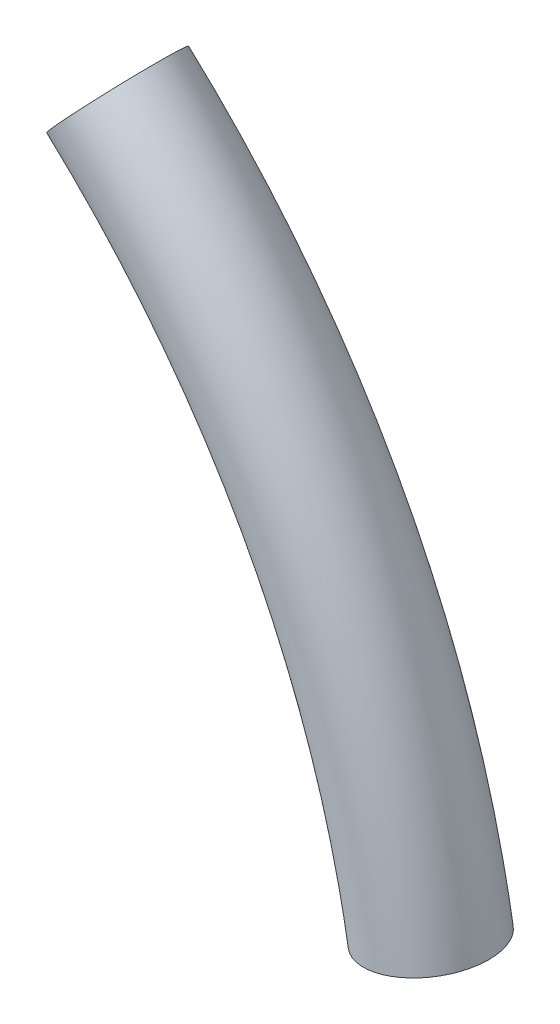
ISO-10303-21;
HEADER;
FILE_DESCRIPTION(('STEP AP214'),'2;1');
FILE_NAME('part.step','',(''),(''),'','','');
FILE_SCHEMA(('AUTOMOTIVE_DESIGN { 1 0 10303 214 1 1 1 1 }'));
ENDSEC;
DATA;
#1=APPLICATION_CONTEXT('core data for automotive mechanical design processes');
#2=APPLICATION_PROTOCOL_DEFINITION('international standard','automotive_design',2000,#1);
#3=PRODUCT_CONTEXT('',#1,'mechanical');
#4=PRODUCT('Part','Part','',(#3));
#5=PRODUCT_RELATED_PRODUCT_CATEGORY('part','',(#4));
#6=PRODUCT_DEFINITION_FORMATION('','',#4);
#7=PRODUCT_DEFINITION_CONTEXT('part definition',#1,'design');
#8=PRODUCT_DEFINITION('design','',#6,#7);
#9=PRODUCT_DEFINITION_SHAPE('','',#8);
#10=(LENGTH_UNIT() NAMED_UNIT(*) SI_UNIT(.MILLI.,.METRE.));
#11=(NAMED_UNIT(*) PLANE_ANGLE_UNIT() SI_UNIT($,.RADIAN.));
#12=(NAMED_UNIT(*) SI_UNIT($,.STERADIAN.) SOLID_ANGLE_UNIT());
#13=UNCERTAINTY_MEASURE_WITH_UNIT(LENGTH_MEASURE(1.E-05),#10,'distance_accuracy_value','');
#14=(GEOMETRIC_REPRESENTATION_CONTEXT(3) GLOBAL_UNCERTAINTY_ASSIGNED_CONTEXT((#13)) GLOBAL_UNIT_ASSIGNED_CONTEXT((#10,
#11,#12)) REPRESENTATION_CONTEXT('',''));
#15=CARTESIAN_POINT('',(0.,0.,0.));
#16=DIRECTION('',(0.,0.,1.));
#17=DIRECTION('',(1.,0.,0.));
#18=AXIS2_PLACEMENT_3D('',#15,#16,#17);
#19=CARTESIAN_POINT('',(0.,0.,-101.5));
#20=DIRECTION('',(0.736829694554362,-0.676078398725271,0.));
#21=DIRECTION('',(0.676078398725271,0.736829694554362,0.));
#22=AXIS2_PLACEMENT_3D('',#19,#20,#21);
#23=PLANE('',#22);
#24=CARTESIAN_POINT('',(4.90980019996349,5.35098679159566,-106.7698));
#25=CARTESIAN_POINT('',(4.90979895214026,5.35098543164508,-106.74734475844));
#26=CARTESIAN_POINT('',(4.90851710616617,5.34958840109457,-106.724869142741));
#27=CARTESIAN_POINT('',(4.90341750681849,5.34403056011521,-106.680517548703));
#28=CARTESIAN_POINT('',(4.89959432603145,5.33986383457442,-106.658642958289));
#29=CARTESIAN_POINT('',(4.88952595748396,5.32889073894603,-106.616190381653));
#30=CARTESIAN_POINT('',(4.88328509258038,5.3220890801601,-106.595610156997));
#31=CARTESIAN_POINT('',(4.86854693682918,5.30602657791048,-106.556262662778));
#32=CARTESIAN_POINT('',(4.86004644498892,5.29676224581817,-106.53749801701));
#33=CARTESIAN_POINT('',(4.8410484341374,5.27605710487703,-106.502372515062));
#34=CARTESIAN_POINT('',(4.83055374795954,5.26461938341536,-106.486008306697));
#35=CARTESIAN_POINT('',(4.80784101835606,5.23986572518907,-106.456095115093));
#36=CARTESIAN_POINT('',(4.79562058296673,5.2265471815228,-106.442550104961));
#37=CARTESIAN_POINT('',(4.76982439127389,5.19843298636209,-106.418698058126));
#38=CARTESIAN_POINT('',(4.75624962861415,5.18363841779862,-106.4083886702));
#39=CARTESIAN_POINT('',(4.72812179725941,5.15298306566095,-106.391286516976));
#40=CARTESIAN_POINT('',(4.71356867106682,5.13712221942254,-106.384493958563));
#41=CARTESIAN_POINT('',(4.68389842957931,5.10478585870784,-106.374619387071));
#42=CARTESIAN_POINT('',(4.66878133088308,5.08831036232178,-106.371537264876));
#43=CARTESIAN_POINT('',(4.63841186556831,5.05521194667375,-106.369170683823));
#44=CARTESIAN_POINT('',(4.62315949894977,5.03858902741179,-106.369886224964));
#45=CARTESIAN_POINT('',(4.59295201698528,5.00566715067217,-106.375094745066));
#46=CARTESIAN_POINT('',(4.57799691039452,4.98936820273643,-106.379587835118));
#47=CARTESIAN_POINT('',(4.54880985059358,4.95755844162202,-106.392223649074));
#48=CARTESIAN_POINT('',(4.53457785490133,4.9420475821439,-106.400366158301));
#49=CARTESIAN_POINT('',(4.50723001278276,4.91224230779563,-106.420076885485));
#50=CARTESIAN_POINT('',(4.49411498746799,4.89794878782076,-106.431647596081));
#51=CARTESIAN_POINT('',(4.46940295234093,4.87101616975632,-106.457865149698));
#52=CARTESIAN_POINT('',(4.45780384605721,4.85837478680982,-106.472507669844));
#53=CARTESIAN_POINT('',(4.43641568142892,4.8350647167945,-106.504486025252));
#54=CARTESIAN_POINT('',(4.42662920209553,4.82439884048254,-106.521825634422));
#55=CARTESIAN_POINT('',(4.40917737894976,4.80537882513794,-106.558664681642));
#56=CARTESIAN_POINT('',(4.40150903826028,4.79702141993371,-106.578161012918));
#57=CARTESIAN_POINT('',(4.38848056492773,4.78282222936021,-106.618813737375));
#58=CARTESIAN_POINT('',(4.3831245721917,4.77698495590321,-106.63997302846));
#59=CARTESIAN_POINT('',(4.37490245471149,4.76802401243429,-106.683286509964));
#60=CARTESIAN_POINT('',(4.37203103119807,4.76489456751441,-106.705438476605));
#61=CARTESIAN_POINT('',(4.36943646358236,4.76206685630904,-106.741730237853));
#62=CARTESIAN_POINT('',(4.36893670085276,4.76152218572041,-106.755761137143));
#63=CARTESIAN_POINT('',(4.36893872880651,4.76152439590275,-106.79225524156));
#64=CARTESIAN_POINT('',(4.3702205747806,4.76292142645326,-106.814730857259));
#65=CARTESIAN_POINT('',(4.37532017412828,4.76847926743263,-106.859082451298));
#66=CARTESIAN_POINT('',(4.37914335491532,4.77264599297341,-106.880957041711));
#67=CARTESIAN_POINT('',(4.38921172346282,4.78361908860181,-106.923409618347));
#68=CARTESIAN_POINT('',(4.39545258836641,4.79042074738775,-106.943989843003));
#69=CARTESIAN_POINT('',(4.4101907441176,4.80648324963737,-106.983337337222));
#70=CARTESIAN_POINT('',(4.41869123595786,4.81574758172968,-107.00210198299));
#71=CARTESIAN_POINT('',(4.43768924680939,4.83645272267082,-107.037227484938));
#72=CARTESIAN_POINT('',(4.44818393298725,4.8478904441325,-107.053591693303));
#73=CARTESIAN_POINT('',(4.47089666259073,4.87264410235879,-107.083504884907));
#74=CARTESIAN_POINT('',(4.48311709798006,4.88596264602506,-107.097049895039));
#75=CARTESIAN_POINT('',(4.5089132896729,4.91407684118576,-107.120901941874));
#76=CARTESIAN_POINT('',(4.52248805233264,4.92887140974924,-107.1312113298));
#77=CARTESIAN_POINT('',(4.55061588368738,4.9595267618869,-107.148313483024));
#78=CARTESIAN_POINT('',(4.56516900987997,4.97538760812532,-107.155106041438));
#79=CARTESIAN_POINT('',(4.59483925136748,5.00772396884002,-107.164980612929));
#80=CARTESIAN_POINT('',(4.60995635006371,5.02419946522608,-107.168062735124));
#81=CARTESIAN_POINT('',(4.64032581537848,5.0572978808741,-107.170429316177));
#82=CARTESIAN_POINT('',(4.65557818199702,5.07392080013607,-107.169713775036));
#83=CARTESIAN_POINT('',(4.68578566396151,5.10684267687569,-107.164505254934));
#84=CARTESIAN_POINT('',(4.70074077055228,5.12314162481143,-107.160012164882));
#85=CARTESIAN_POINT('',(4.72992783035322,5.15495138592584,-107.147376350926));
#86=CARTESIAN_POINT('',(4.74415982604546,5.17046224540396,-107.139233841699));
#87=CARTESIAN_POINT('',(4.77150766816403,5.20026751975223,-107.119523114515));
#88=CARTESIAN_POINT('',(4.7846226934788,5.21456103972709,-107.107952403919));
#89=CARTESIAN_POINT('',(4.80933472860586,5.24149365779153,-107.081734850302));
#90=CARTESIAN_POINT('',(4.82093383488958,5.25413504073803,-107.067092330157));
#91=CARTESIAN_POINT('',(4.84232199951786,5.27744511075336,-107.035113974748));
#92=CARTESIAN_POINT('',(4.85210847885125,5.2881109870653,-107.017774365578));
#93=CARTESIAN_POINT('',(4.86956030199701,5.30713100240991,-106.980935318358));
#94=CARTESIAN_POINT('',(4.8772286426865,5.31548840761413,-106.961438987082));
#95=CARTESIAN_POINT('',(4.89025711601904,5.32968759818763,-106.920786262625));
#96=CARTESIAN_POINT('',(4.89561310875508,5.33552487164463,-106.89962697154));
#97=CARTESIAN_POINT('',(4.90383522623529,5.34448581511354,-106.856313490036));
#98=CARTESIAN_POINT('',(4.90670664974871,5.34761526003342,-106.834161523395));
#99=CARTESIAN_POINT('',(4.90930121736441,5.35044297123879,-106.797869762147));
#100=CARTESIAN_POINT('',(4.90980098009401,5.35098764182742,-106.783838862857));
#101=CARTESIAN_POINT('',(4.90980019996349,5.35098679159566,-106.7698));
#102=B_SPLINE_CURVE_WITH_KNOTS('',3,(#24,#25,#26,#27,#28,#29,#30,#31,#32,#33,#34,#35,#36,#37,
#38,#39,#40,#41,#42,#43,#44,#45,#46,#47,#48,#49,#50,#51,#52,#53,#54,#55,#56,#57,#58,#59,#60,#61,
#62,#63,#64,#65,#66,#67,#68,#69,#70,#71,#72,#73,#74,#75,#76,#77,#78,#79,#80,#81,#82,#83,#84,#85,
#86,#87,#88,#89,#90,#91,#92,#93,#94,#95,#96,#97,#98,#99,#100,#101),.UNSPECIFIED.,.T.,.F.,(4,2,2,
2,2,2,2,2,2,2,2,2,2,2,2,2,2,2,2,2,2,2,2,2,2,2,2,2,2,2,2,2,2,2,2,2,2,2,4),(0.,0.0673217190940811,
0.13478767805546,0.202133559490903,0.269575356418624,0.336922056232697,0.404363034793476,
0.47175489208367,0.539150713403571,0.606544552708827,0.673938392014083,0.74133421333398,
0.808726070624175,0.876167049184949,0.943513748999017,1.01095554592846,1.07830142736562,
1.14576738632871,1.2130891054245,1.25517818200739,1.32249990110147,1.38996586006286,
1.4573117414983,1.52475353842604,1.59210023824011,1.65954121680087,1.72693307409107,
1.79432889541097,1.86172273471622,1.92911657402148,1.99651239534138,2.06390425263158,
2.13134523119235,2.19869193100642,2.26613372793585,2.33347960937301,2.40094556833612,
2.4682672874319,2.51035636401472),.UNSPECIFIED.);
#103=CARTESIAN_POINT('',(4.90980019996349,5.35098679159566,-106.7698));
#104=VERTEX_POINT('',#103);
#105=EDGE_CURVE('E18',#104,#104,#102,.T.);
#106=ORIENTED_EDGE('',*,*,#105,.F.);
#107=EDGE_LOOP('',(#106));
#108=FACE_BOUND('',#107,.T.);
#109=ADVANCED_FACE('F14',(#108),#23,.F.);
#110=CARTESIAN_POINT('',(0.,0.,-101.5));
#111=DIRECTION('',(0.164394298490583,-0.986394705289819,0.));
#112=DIRECTION('',(0.986394705289819,0.164394298490583,0.));
#113=AXIS2_PLACEMENT_3D('',#110,#111,#112);
#114=PLANE('',#113);
#115=CARTESIAN_POINT('',(6.3742560139617,1.06234486072868,-106.7698));
#116=CARTESIAN_POINT('',(6.374257834529,1.06234516414767,-106.74734475844));
#117=CARTESIAN_POINT('',(6.37612804083086,1.06265685606104,-106.724869142741));
#118=CARTESIAN_POINT('',(6.3835683285329,1.06389686766165,-106.680517548703));
#119=CARTESIAN_POINT('',(6.38914632849978,1.06482650707133,-106.658642958289));
#120=CARTESIAN_POINT('',(6.40383602342995,1.0672747177928,-106.616190381653));
#121=CARTESIAN_POINT('',(6.41294141136859,1.06879223796462,-106.595610156997));
#122=CARTESIAN_POINT('',(6.43444430042128,1.07237594775379,-106.556262662778));
#123=CARTESIAN_POINT('',(6.44684647176621,1.07444291572014,-106.53749801701));
#124=CARTESIAN_POINT('',(6.474564466233,1.0790624460476,-106.502372515062));
#125=CARTESIAN_POINT('',(6.48987615626634,1.08161431958082,-106.486008306697));
#126=CARTESIAN_POINT('',(6.52301390518094,1.0871371158379,-106.456095115093));
#127=CARTESIAN_POINT('',(6.54084345392426,1.09010862018838,-106.442550104961));
#128=CARTESIAN_POINT('',(6.57847995725054,1.09638118686862,-106.418698058126));
#129=CARTESIAN_POINT('',(6.59828546211267,1.09968200758531,-106.4083886702));
#130=CARTESIAN_POINT('',(6.63932381501955,1.10652153257582,-106.391286516976));
#131=CARTESIAN_POINT('',(6.66055674695296,1.11006025083067,-106.384493958563));
#132=CARTESIAN_POINT('',(6.7038454678515,1.11727482615889,-106.374619387071));
#133=CARTESIAN_POINT('',(6.72590123259923,1.12095067919615,-106.371537264876));
#134=CARTESIAN_POINT('',(6.77021011725736,1.12833527683359,-106.369170683823));
#135=CARTESIAN_POINT('',(6.79246323716776,1.13204402143378,-106.369886224964));
#136=CARTESIAN_POINT('',(6.83653578899917,1.13938923142138,-106.375094745066));
#137=CARTESIAN_POINT('',(6.8583552081464,1.1430256946799,-106.379587835118));
#138=CARTESIAN_POINT('',(6.90093896959316,1.15012278021025,-106.392223649074));
#139=CARTESIAN_POINT('',(6.9217033738738,1.15358341281198,-106.400366158301));
#140=CARTESIAN_POINT('',(6.96160372672892,1.16023327668692,-106.420076885485));
#141=CARTESIAN_POINT('',(6.9807384773061,1.16342230829978,-106.431647596081));
#142=CARTESIAN_POINT('',(7.01679320210166,1.16943125295272,-106.457865149698));
#143=CARTESIAN_POINT('',(7.03371623506046,1.17225167576792,-106.472507669844));
#144=CARTESIAN_POINT('',(7.06492145088304,1.17745239261777,-106.504486025252));
#145=CARTESIAN_POINT('',(7.07919987098356,1.17983205954358,-106.521825634422));
#146=CARTESIAN_POINT('',(7.10466198600025,1.18407562098385,-106.558664681642));
#147=CARTESIAN_POINT('',(7.11585005334381,1.18594024421485,-106.578161012918));
#148=CARTESIAN_POINT('',(7.13485852504984,1.18910822996612,-106.618813737375));
#149=CARTESIAN_POINT('',(7.14267288931049,1.19041058583228,-106.63997302846));
#150=CARTESIAN_POINT('',(7.1546689139787,1.19240986467008,-106.683286509964));
#151=CARTESIAN_POINT('',(7.15885830526176,1.19310807608321,-106.705438476605));
#152=CARTESIAN_POINT('',(7.16264376529639,1.19373896759501,-106.741730237853));
#153=CARTESIAN_POINT('',(7.16337291639974,1.19386048921662,-106.755761137143));
#154=CARTESIAN_POINT('',(7.16336995762625,1.19385999610216,-106.79225524156));
#155=CARTESIAN_POINT('',(7.16149975132439,1.19354830418879,-106.814730857259));
#156=CARTESIAN_POINT('',(7.15405946362236,1.19230829258817,-106.859082451298));
#157=CARTESIAN_POINT('',(7.14848146365547,1.1913786531785,-106.880957041711));
#158=CARTESIAN_POINT('',(7.1337917687253,1.18893044245703,-106.923409618347));
#159=CARTESIAN_POINT('',(7.12468638078665,1.18741292228521,-106.943989843003));
#160=CARTESIAN_POINT('',(7.10318349173395,1.18382921249603,-106.983337337222));
#161=CARTESIAN_POINT('',(7.09078132038903,1.18176224452968,-107.00210198299));
#162=CARTESIAN_POINT('',(7.06306332592224,1.17714271420222,-107.037227484938));
#163=CARTESIAN_POINT('',(7.04775163588889,1.174590840669,-107.053591693303));
#164=CARTESIAN_POINT('',(7.01461388697428,1.16906804441192,-107.083504884907));
#165=CARTESIAN_POINT('',(6.99678433823097,1.16609654006145,-107.097049895039));
#166=CARTESIAN_POINT('',(6.95914783490469,1.15982397338121,-107.120901941874));
#167=CARTESIAN_POINT('',(6.93934233004256,1.15652315266451,-107.1312113298));
#168=CARTESIAN_POINT('',(6.89830397713568,1.149683627674,-107.148313483024));
#169=CARTESIAN_POINT('',(6.87707104520227,1.14614490941916,-107.155106041438));
#170=CARTESIAN_POINT('',(6.83378232430373,1.13893033409094,-107.164980612929));
#171=CARTESIAN_POINT('',(6.811726559556,1.13525448105368,-107.168062735124));
#172=CARTESIAN_POINT('',(6.76741767489787,1.12786988341623,-107.170429316177));
#173=CARTESIAN_POINT('',(6.74516455498747,1.12416113881604,-107.169713775036));
#174=CARTESIAN_POINT('',(6.70109200315607,1.11681592882844,-107.164505254934));
#175=CARTESIAN_POINT('',(6.67927258400883,1.11317946556992,-107.160012164882));
#176=CARTESIAN_POINT('',(6.63668882256208,1.10608238003957,-107.147376350926));
#177=CARTESIAN_POINT('',(6.61592441828143,1.10262174743785,-107.139233841699));
#178=CARTESIAN_POINT('',(6.57602406542631,1.0959718835629,-107.119523114515));
#179=CARTESIAN_POINT('',(6.55688931484913,1.09278285195004,-107.107952403919));
#180=CARTESIAN_POINT('',(6.52083459005357,1.0867739072971,-107.081734850302));
#181=CARTESIAN_POINT('',(6.50391155709477,1.0839534844819,-107.067092330157));
#182=CARTESIAN_POINT('',(6.4727063412722,1.07875276763206,-107.035113974748));
#183=CARTESIAN_POINT('',(6.45842792117168,1.07637310070624,-107.017774365578));
#184=CARTESIAN_POINT('',(6.432965806155,1.07212953926597,-106.980935318358));
#185=CARTESIAN_POINT('',(6.42177773881144,1.07026491603498,-106.961438987082));
#186=CARTESIAN_POINT('',(6.4027692671054,1.06709693028371,-106.920786262625));
#187=CARTESIAN_POINT('',(6.39495490284475,1.06579457441755,-106.89962697154));
#188=CARTESIAN_POINT('',(6.38295887817655,1.06379529557974,-106.856313490036));
#189=CARTESIAN_POINT('',(6.37876948689349,1.06309708416662,-106.834161523395));
#190=CARTESIAN_POINT('',(6.37498402685886,1.06246619265482,-106.797869762147));
#191=CARTESIAN_POINT('',(6.37425487575552,1.06234467103321,-106.783838862858));
#192=CARTESIAN_POINT('',(6.3742560139617,1.06234486072868,-106.7698));
#193=B_SPLINE_CURVE_WITH_KNOTS('',3,(#115,#116,#117,#118,#119,#120,#121,#122,#123,#124,#125,
#126,#127,#128,#129,#130,#131,#132,#133,#134,#135,#136,#137,#138,#139,#140,#141,#142,#143,#144,
#145,#146,#147,#148,#149,#150,#151,#152,#153,#154,#155,#156,#157,#158,#159,#160,#161,#162,#163,
#164,#165,#166,#167,#168,#169,#170,#171,#172,#173,#174,#175,#176,#177,#178,#179,#180,#181,#182,
#183,#184,#185,#186,#187,#188,#189,#190,#191,#192),.UNSPECIFIED.,.T.,.F.,(4,2,2,2,2,2,2,2,2,2,2,
2,2,2,2,2,2,2,2,2,2,2,2,2,2,2,2,2,2,2,2,2,2,2,2,2,2,2,4),(0.,0.0673217190940811,
0.13478767805546,0.202133559490903,0.269575356418625,0.336922056232688,0.404363034793475,
0.471754892083667,0.539150713403569,0.606544552708825,0.673938392014082,0.741334213333979,
0.808726070624174,0.876167049184948,0.943513748999015,1.01095554592846,1.07830142736562,
1.14576738632871,1.2130891054245,1.25517818200739,1.32249990110147,1.38996586006285,
1.45731174149828,1.52475353842602,1.59210023824009,1.65954121680086,1.72693307409106,
1.79432889541095,1.86172273471621,1.92911657402146,1.99651239534136,2.06390425263156,
2.13134523119234,2.1986919310064,2.26613372793584,2.33347960937299,2.4009455683361,
2.46826728743187,2.51035636401472),.UNSPECIFIED.);
#194=CARTESIAN_POINT('',(6.3742560139617,1.06234486072868,-106.7698));
#195=VERTEX_POINT('',#194);
#196=EDGE_CURVE('E10',#195,#195,#193,.T.);
#197=ORIENTED_EDGE('',*,*,#196,.F.);
#198=EDGE_LOOP('',(#197));
#199=FACE_BOUND('',#198,.T.);
#200=ADVANCED_FACE('F36',(#199),#114,.T.);
#201=CARTESIAN_POINT('',(0.,0.,-106.7698));
#202=DIRECTION('',(0.,0.,-1.));
#203=DIRECTION('',(0.164394298490583,-0.986394705289819,0.));
#204=AXIS2_PLACEMENT_3D('',#201,#202,#203);
#205=TOROIDAL_SURFACE('',#204,6.86217582046821,0.4);
#206=ORIENTED_EDGE('',*,*,#105,.T.);
#207=EDGE_LOOP('',(#206));
#208=FACE_BOUND('',#207,.T.);
#209=ORIENTED_EDGE('',*,*,#196,.T.);
#210=EDGE_LOOP('',(#209));
#211=FACE_BOUND('',#210,.T.);
#212=ADVANCED_FACE('F34',(#208,#211),#205,.T.);
#213=CLOSED_SHELL('',(#109,#200,#212));
#214=MANIFOLD_SOLID_BREP('B1',#213);
#215=ADVANCED_BREP_SHAPE_REPRESENTATION('',(#18,#214),#14);
#216=SHAPE_DEFINITION_REPRESENTATION(#9,#215);
ENDSEC;
END-ISO-10303-21;
